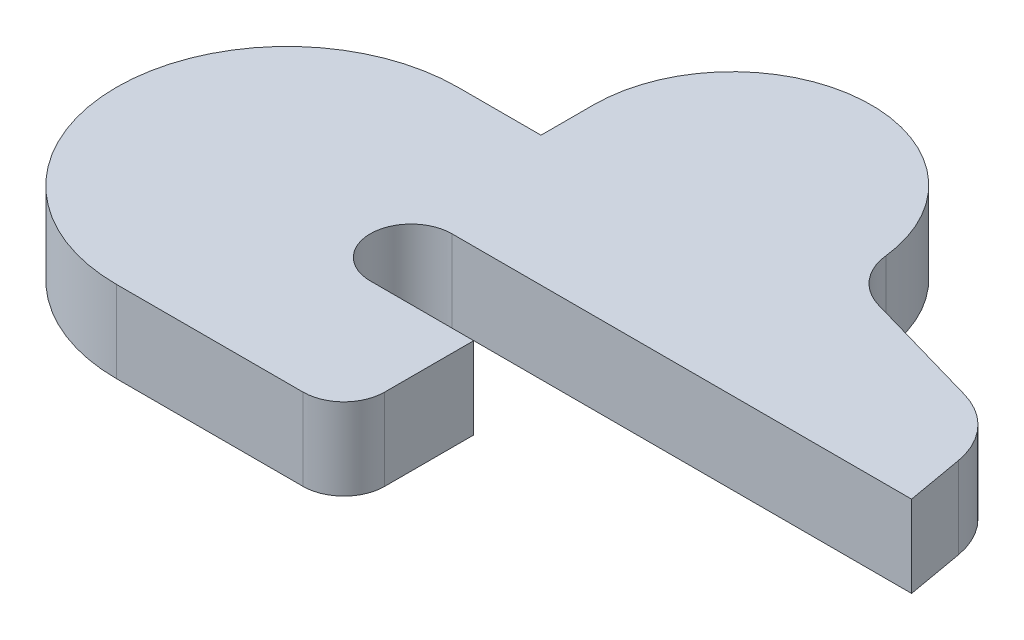
ISO-10303-21;
HEADER;
FILE_DESCRIPTION(('STEP AP214'),'2;1');
FILE_NAME('part.step','',(''),(''),'','','');
FILE_SCHEMA(('AUTOMOTIVE_DESIGN { 1 0 10303 214 1 1 1 1 }'));
ENDSEC;
DATA;
#1=APPLICATION_CONTEXT('core data for automotive mechanical design processes');
#2=APPLICATION_PROTOCOL_DEFINITION('international standard','automotive_design',2000,#1);
#3=PRODUCT_CONTEXT('',#1,'mechanical');
#4=PRODUCT('Part','Part','',(#3));
#5=PRODUCT_RELATED_PRODUCT_CATEGORY('part','',(#4));
#6=PRODUCT_DEFINITION_FORMATION('','',#4);
#7=PRODUCT_DEFINITION_CONTEXT('part definition',#1,'design');
#8=PRODUCT_DEFINITION('design','',#6,#7);
#9=PRODUCT_DEFINITION_SHAPE('','',#8);
#10=(LENGTH_UNIT() NAMED_UNIT(*) SI_UNIT(.MILLI.,.METRE.));
#11=(NAMED_UNIT(*) PLANE_ANGLE_UNIT() SI_UNIT($,.RADIAN.));
#12=(NAMED_UNIT(*) SI_UNIT($,.STERADIAN.) SOLID_ANGLE_UNIT());
#13=UNCERTAINTY_MEASURE_WITH_UNIT(LENGTH_MEASURE(1.E-05),#10,'distance_accuracy_value','');
#14=(GEOMETRIC_REPRESENTATION_CONTEXT(3) GLOBAL_UNCERTAINTY_ASSIGNED_CONTEXT((#13)) GLOBAL_UNIT_ASSIGNED_CONTEXT((#10,
#11,#12)) REPRESENTATION_CONTEXT('',''));
#15=CARTESIAN_POINT('',(0.,0.,0.));
#16=DIRECTION('',(0.,0.,1.));
#17=DIRECTION('',(1.,0.,0.));
#18=AXIS2_PLACEMENT_3D('',#15,#16,#17);
#19=CARTESIAN_POINT('',(0.,3.,3.27));
#20=DIRECTION('',(-1.,0.,0.));
#21=DIRECTION('',(0.,0.,1.));
#22=AXIS2_PLACEMENT_3D('',#19,#20,#21);
#23=PLANE('',#22);
#24=DIRECTION('',(0.,0.,-1.));
#25=VECTOR('',#24,1.);
#26=CARTESIAN_POINT('',(0.,0.,3.27));
#27=LINE('',#26,#25);
#28=CARTESIAN_POINT('',(0.,0.,3.27));
#29=VERTEX_POINT('',#28);
#30=CARTESIAN_POINT('',(0.,0.,0.));
#31=VERTEX_POINT('',#30);
#32=EDGE_CURVE('E165',#29,#31,#27,.T.);
#33=ORIENTED_EDGE('',*,*,#32,.T.);
#34=DIRECTION('',(0.,-1.,0.));
#35=VECTOR('',#34,1.);
#36=CARTESIAN_POINT('',(0.,3.,0.));
#37=LINE('',#36,#35);
#38=CARTESIAN_POINT('',(0.,3.,0.));
#39=VERTEX_POINT('',#38);
#40=EDGE_CURVE('E11',#39,#31,#37,.T.);
#41=ORIENTED_EDGE('',*,*,#40,.F.);
#42=DIRECTION('',(0.,0.,-1.));
#43=VECTOR('',#42,1.);
#44=CARTESIAN_POINT('',(0.,3.,3.27));
#45=LINE('',#44,#43);
#46=CARTESIAN_POINT('',(0.,3.,3.27));
#47=VERTEX_POINT('',#46);
#48=EDGE_CURVE('E191',#47,#39,#45,.T.);
#49=ORIENTED_EDGE('',*,*,#48,.F.);
#50=DIRECTION('',(0.,-1.,0.));
#51=VECTOR('',#50,1.);
#52=CARTESIAN_POINT('',(0.,3.,3.27));
#53=LINE('',#52,#51);
#54=EDGE_CURVE('E161',#47,#29,#53,.T.);
#55=ORIENTED_EDGE('',*,*,#54,.T.);
#56=EDGE_LOOP('',(#33,#41,#49,#55));
#57=FACE_BOUND('',#56,.T.);
#58=ADVANCED_FACE('F33',(#57),#23,.F.);
#59=CARTESIAN_POINT('',(0.,3.,0.));
#60=DIRECTION('',(0.,0.,1.));
#61=DIRECTION('',(1.,0.,0.));
#62=AXIS2_PLACEMENT_3D('',#59,#60,#61);
#63=PLANE('',#62);
#64=DIRECTION('',(-1.,0.,0.));
#65=VECTOR('',#64,1.);
#66=CARTESIAN_POINT('',(0.,0.,0.));
#67=LINE('',#66,#65);
#68=CARTESIAN_POINT('',(-3.8,0.,0.));
#69=VERTEX_POINT('',#68);
#70=EDGE_CURVE('E168',#31,#69,#67,.T.);
#71=ORIENTED_EDGE('',*,*,#70,.T.);
#72=DIRECTION('',(0.,-1.,0.));
#73=VECTOR('',#72,1.);
#74=CARTESIAN_POINT('',(-3.8,3.,0.));
#75=LINE('',#74,#73);
#76=CARTESIAN_POINT('',(-3.8,3.,0.));
#77=VERTEX_POINT('',#76);
#78=EDGE_CURVE('E41',#77,#69,#75,.T.);
#79=ORIENTED_EDGE('',*,*,#78,.F.);
#80=DIRECTION('',(-1.,0.,0.));
#81=VECTOR('',#80,1.);
#82=CARTESIAN_POINT('',(0.,3.,0.));
#83=LINE('',#82,#81);
#84=EDGE_CURVE('E110',#39,#77,#83,.T.);
#85=ORIENTED_EDGE('',*,*,#84,.F.);
#86=ORIENTED_EDGE('',*,*,#40,.T.);
#87=EDGE_LOOP('',(#71,#79,#85,#86));
#88=FACE_BOUND('',#87,.T.);
#89=ADVANCED_FACE('F279',(#88),#63,.F.);
#90=CARTESIAN_POINT('',(-3.8,3.,-1.5));
#91=DIRECTION('',(0.,-1.,0.));
#92=DIRECTION('',(0.,0.,-1.));
#93=AXIS2_PLACEMENT_3D('',#90,#91,#92);
#94=CYLINDRICAL_SURFACE('',#93,1.5);
#95=CARTESIAN_POINT('',(-3.8,0.,-1.5));
#96=DIRECTION('',(0.,-1.,0.));
#97=DIRECTION('',(0.,0.,-1.));
#98=AXIS2_PLACEMENT_3D('',#95,#96,#97);
#99=CIRCLE('',#98,1.5);
#100=CARTESIAN_POINT('',(-3.8,0.,-3.));
#101=VERTEX_POINT('',#100);
#102=EDGE_CURVE('E170',#69,#101,#99,.T.);
#103=ORIENTED_EDGE('',*,*,#102,.T.);
#104=DIRECTION('',(0.,-1.,0.));
#105=VECTOR('',#104,1.);
#106=CARTESIAN_POINT('',(-3.8,3.,-3.));
#107=LINE('',#106,#105);
#108=CARTESIAN_POINT('',(-3.8,3.,-3.));
#109=VERTEX_POINT('',#108);
#110=EDGE_CURVE('E216',#109,#101,#107,.T.);
#111=ORIENTED_EDGE('',*,*,#110,.F.);
#112=CARTESIAN_POINT('',(-3.8,3.,-1.5));
#113=DIRECTION('',(0.,-1.,0.));
#114=DIRECTION('',(0.,0.,-1.));
#115=AXIS2_PLACEMENT_3D('',#112,#113,#114);
#116=CIRCLE('',#115,1.5);
#117=EDGE_CURVE('E224',#77,#109,#116,.T.);
#118=ORIENTED_EDGE('',*,*,#117,.F.);
#119=ORIENTED_EDGE('',*,*,#78,.T.);
#120=EDGE_LOOP('',(#103,#111,#118,#119));
#121=FACE_BOUND('',#120,.T.);
#122=ADVANCED_FACE('F222',(#121),#94,.F.);
#123=CARTESIAN_POINT('',(-3.8,3.,-3.));
#124=DIRECTION('',(0.,0.,-1.));
#125=DIRECTION('',(-1.,0.,0.));
#126=AXIS2_PLACEMENT_3D('',#123,#124,#125);
#127=PLANE('',#126);
#128=DIRECTION('',(1.,0.,0.));
#129=VECTOR('',#128,1.);
#130=CARTESIAN_POINT('',(-3.8,0.,-3.));
#131=LINE('',#130,#129);
#132=CARTESIAN_POINT('',(13.0795080486299,0.,-3.));
#133=VERTEX_POINT('',#132);
#134=EDGE_CURVE('E172',#101,#133,#131,.T.);
#135=ORIENTED_EDGE('',*,*,#134,.T.);
#136=DIRECTION('',(0.,-1.,0.));
#137=VECTOR('',#136,1.);
#138=CARTESIAN_POINT('',(13.0795080486299,3.,-3.));
#139=LINE('',#138,#137);
#140=CARTESIAN_POINT('',(13.0795080486299,3.,-3.));
#141=VERTEX_POINT('',#140);
#142=EDGE_CURVE('E213',#141,#133,#139,.T.);
#143=ORIENTED_EDGE('',*,*,#142,.F.);
#144=DIRECTION('',(1.,0.,0.));
#145=VECTOR('',#144,1.);
#146=CARTESIAN_POINT('',(-3.8,3.,-3.));
#147=LINE('',#146,#145);
#148=EDGE_CURVE('E242',#109,#141,#147,.T.);
#149=ORIENTED_EDGE('',*,*,#148,.F.);
#150=ORIENTED_EDGE('',*,*,#110,.T.);
#151=EDGE_LOOP('',(#135,#143,#149,#150));
#152=FACE_BOUND('',#151,.T.);
#153=ADVANCED_FACE('F233',(#152),#127,.F.);
#154=CARTESIAN_POINT('',(13.0795080486299,3.,-3.));
#155=DIRECTION('',(-0.984807753012208,0.,0.173648177666934));
#156=DIRECTION('',(0.173648177666934,0.,0.984807753012208));
#157=AXIS2_PLACEMENT_3D('',#154,#155,#156);
#158=PLANE('',#157);
#159=DIRECTION('',(-0.173648177666934,0.,-0.984807753012207));
#160=VECTOR('',#159,1.);
#161=CARTESIAN_POINT('',(13.0795080486299,0.,-3.));
#162=LINE('',#161,#160);
#163=CARTESIAN_POINT('',(12.7106381862888,0.,-5.09196494409998));
#164=VERTEX_POINT('',#163);
#165=EDGE_CURVE('E174',#133,#164,#162,.T.);
#166=ORIENTED_EDGE('',*,*,#165,.T.);
#167=DIRECTION('',(0.,-1.,0.));
#168=VECTOR('',#167,1.);
#169=CARTESIAN_POINT('',(12.7106381862888,3.,-5.09196494409998));
#170=LINE('',#169,#168);
#171=CARTESIAN_POINT('',(12.7106381862888,3.,-5.09196494409998));
#172=VERTEX_POINT('',#171);
#173=EDGE_CURVE('E210',#172,#164,#170,.T.);
#174=ORIENTED_EDGE('',*,*,#173,.F.);
#175=DIRECTION('',(-0.173648177666934,0.,-0.984807753012207));
#176=VECTOR('',#175,1.);
#177=CARTESIAN_POINT('',(13.0795080486299,3.,-3.));
#178=LINE('',#177,#176);
#179=EDGE_CURVE('E239',#141,#172,#178,.T.);
#180=ORIENTED_EDGE('',*,*,#179,.F.);
#181=ORIENTED_EDGE('',*,*,#142,.T.);
#182=EDGE_LOOP('',(#166,#174,#180,#181));
#183=FACE_BOUND('',#182,.T.);
#184=ADVANCED_FACE('F237',(#183),#158,.F.);
#185=CARTESIAN_POINT('',(9.95317647785463,3.,-4.60575004663256));
#186=DIRECTION('',(0.,-1.,0.));
#187=DIRECTION('',(0.,0.,-1.));
#188=AXIS2_PLACEMENT_3D('',#185,#186,#187);
#189=CYLINDRICAL_SURFACE('',#188,2.8);
#190=CARTESIAN_POINT('',(9.95317647785463,0.,-4.60575004663256));
#191=DIRECTION('',(0.,1.,0.));
#192=DIRECTION('',(0.,0.,1.));
#193=AXIS2_PLACEMENT_3D('',#190,#191,#192);
#194=CIRCLE('',#193,2.8);
#195=CARTESIAN_POINT('',(10.7249610741422,0.,-7.29728279525986));
#196=VERTEX_POINT('',#195);
#197=EDGE_CURVE('E176',#164,#196,#194,.T.);
#198=ORIENTED_EDGE('',*,*,#197,.T.);
#199=DIRECTION('',(0.,-1.,0.));
#200=VECTOR('',#199,1.);
#201=CARTESIAN_POINT('',(10.7249610741422,3.,-7.29728279525986));
#202=LINE('',#201,#200);
#203=CARTESIAN_POINT('',(10.7249610741422,3.,-7.29728279525986));
#204=VERTEX_POINT('',#203);
#205=EDGE_CURVE('E207',#204,#196,#202,.T.);
#206=ORIENTED_EDGE('',*,*,#205,.F.);
#207=CARTESIAN_POINT('',(9.95317647785463,3.,-4.60575004663256));
#208=DIRECTION('',(0.,1.,0.));
#209=DIRECTION('',(0.,0.,1.));
#210=AXIS2_PLACEMENT_3D('',#207,#208,#209);
#211=CIRCLE('',#210,2.8);
#212=EDGE_CURVE('E241',#172,#204,#211,.T.);
#213=ORIENTED_EDGE('',*,*,#212,.F.);
#214=ORIENTED_EDGE('',*,*,#173,.T.);
#215=EDGE_LOOP('',(#198,#206,#213,#214));
#216=FACE_BOUND('',#215,.T.);
#217=ADVANCED_FACE('F292',(#216),#189,.T.);
#218=CARTESIAN_POINT('',(6.30470677412437,3.,-8.56477031967051));
#219=DIRECTION('',(-0.275637355816999,0.,0.961261695938319));
#220=DIRECTION('',(0.961261695938319,0.,0.275637355816999));
#221=AXIS2_PLACEMENT_3D('',#218,#219,#220);
#222=PLANE('',#221);
#223=DIRECTION('',(-0.961261695938319,0.,-0.275637355816999));
#224=VECTOR('',#223,1.);
#225=CARTESIAN_POINT('',(6.30470677412437,0.,-8.56477031967051));
#226=LINE('',#225,#224);
#227=CARTESIAN_POINT('',(6.30470677412437,0.,-8.56477031967051));
#228=VERTEX_POINT('',#227);
#229=EDGE_CURVE('E178',#196,#228,#226,.T.);
#230=ORIENTED_EDGE('',*,*,#229,.T.);
#231=DIRECTION('',(0.,-1.,0.));
#232=VECTOR('',#231,1.);
#233=CARTESIAN_POINT('',(6.30470677412437,3.,-8.56477031967051));
#234=LINE('',#233,#232);
#235=CARTESIAN_POINT('',(6.30470677412437,3.,-8.56477031967051));
#236=VERTEX_POINT('',#235);
#237=EDGE_CURVE('E204',#236,#228,#234,.T.);
#238=ORIENTED_EDGE('',*,*,#237,.F.);
#239=DIRECTION('',(-0.961261695938319,0.,-0.275637355816999));
#240=VECTOR('',#239,1.);
#241=CARTESIAN_POINT('',(6.30470677412437,3.,-8.56477031967051));
#242=LINE('',#241,#240);
#243=EDGE_CURVE('E244',#204,#236,#242,.T.);
#244=ORIENTED_EDGE('',*,*,#243,.F.);
#245=ORIENTED_EDGE('',*,*,#205,.T.);
#246=EDGE_LOOP('',(#230,#238,#244,#245));
#247=FACE_BOUND('',#246,.T.);
#248=ADVANCED_FACE('F295',(#247),#222,.F.);
#249=CARTESIAN_POINT('',(6.85598148575838,3.,-10.4872937115471));
#250=DIRECTION('',(0.,-1.,0.));
#251=DIRECTION('',(0.,0.,-1.));
#252=AXIS2_PLACEMENT_3D('',#249,#250,#251);
#253=CYLINDRICAL_SURFACE('',#252,2.);
#254=CARTESIAN_POINT('',(6.85598148575838,0.,-10.4872937115471));
#255=DIRECTION('',(0.,-1.,0.));
#256=DIRECTION('',(0.,0.,1.));
#257=AXIS2_PLACEMENT_3D('',#254,#255,#256);
#258=CIRCLE('',#257,2.);
#259=CARTESIAN_POINT('',(4.86838106723489,0.,-10.2649323473553));
#260=VERTEX_POINT('',#259);
#261=EDGE_CURVE('E180',#228,#260,#258,.T.);
#262=ORIENTED_EDGE('',*,*,#261,.T.);
#263=DIRECTION('',(0.,-1.,0.));
#264=VECTOR('',#263,1.);
#265=CARTESIAN_POINT('',(4.86838106723489,3.,-10.2649323473553));
#266=LINE('',#265,#264);
#267=CARTESIAN_POINT('',(4.86838106723489,3.,-10.2649323473553));
#268=VERTEX_POINT('',#267);
#269=EDGE_CURVE('E201',#268,#260,#266,.T.);
#270=ORIENTED_EDGE('',*,*,#269,.F.);
#271=CARTESIAN_POINT('',(6.85598148575838,3.,-10.4872937115471));
#272=DIRECTION('',(0.,-1.,0.));
#273=DIRECTION('',(0.,0.,1.));
#274=AXIS2_PLACEMENT_3D('',#271,#272,#273);
#275=CIRCLE('',#274,2.);
#276=EDGE_CURVE('E250',#236,#268,#275,.T.);
#277=ORIENTED_EDGE('',*,*,#276,.F.);
#278=ORIENTED_EDGE('',*,*,#237,.T.);
#279=EDGE_LOOP('',(#262,#270,#277,#278));
#280=FACE_BOUND('',#279,.T.);
#281=ADVANCED_FACE('F299',(#280),#253,.F.);
#282=CARTESIAN_POINT('',(-0.200000000000002,3.,-9.69791086866609));
#283=DIRECTION('',(0.,-1.,0.));
#284=DIRECTION('',(0.,0.,-1.));
#285=AXIS2_PLACEMENT_3D('',#282,#283,#284);
#286=CYLINDRICAL_SURFACE('',#285,5.1);
#287=CARTESIAN_POINT('',(-0.200000000000002,0.,-9.69791086866609));
#288=DIRECTION('',(0.,1.,0.));
#289=DIRECTION('',(0.,0.,-1.));
#290=AXIS2_PLACEMENT_3D('',#287,#288,#289);
#291=CIRCLE('',#290,5.1);
#292=CARTESIAN_POINT('',(-5.3,0.,-9.69791086866608));
#293=VERTEX_POINT('',#292);
#294=EDGE_CURVE('E182',#260,#293,#291,.T.);
#295=ORIENTED_EDGE('',*,*,#294,.T.);
#296=DIRECTION('',(0.,-1.,0.));
#297=VECTOR('',#296,1.);
#298=CARTESIAN_POINT('',(-5.3,3.,-9.69791086866608));
#299=LINE('',#298,#297);
#300=CARTESIAN_POINT('',(-5.3,3.,-9.69791086866608));
#301=VERTEX_POINT('',#300);
#302=EDGE_CURVE('E198',#301,#293,#299,.T.);
#303=ORIENTED_EDGE('',*,*,#302,.F.);
#304=CARTESIAN_POINT('',(-0.200000000000002,3.,-9.69791086866609));
#305=DIRECTION('',(0.,1.,0.));
#306=DIRECTION('',(0.,0.,-1.));
#307=AXIS2_PLACEMENT_3D('',#304,#305,#306);
#308=CIRCLE('',#307,5.1);
#309=EDGE_CURVE('E252',#268,#301,#308,.T.);
#310=ORIENTED_EDGE('',*,*,#309,.F.);
#311=ORIENTED_EDGE('',*,*,#269,.T.);
#312=EDGE_LOOP('',(#295,#303,#310,#311));
#313=FACE_BOUND('',#312,.T.);
#314=ADVANCED_FACE('F303',(#313),#286,.T.);
#315=CARTESIAN_POINT('',(-5.3,3.,-9.69791086866609));
#316=DIRECTION('',(1.,0.,0.));
#317=DIRECTION('',(0.,0.,-1.));
#318=AXIS2_PLACEMENT_3D('',#315,#316,#317);
#319=PLANE('',#318);
#320=DIRECTION('',(0.,0.,1.));
#321=VECTOR('',#320,1.);
#322=CARTESIAN_POINT('',(-5.3,0.,-9.69791086866609));
#323=LINE('',#322,#321);
#324=CARTESIAN_POINT('',(-5.3,0.,-7.77));
#325=VERTEX_POINT('',#324);
#326=EDGE_CURVE('E184',#293,#325,#323,.T.);
#327=ORIENTED_EDGE('',*,*,#326,.T.);
#328=DIRECTION('',(0.,-1.,0.));
#329=VECTOR('',#328,1.);
#330=CARTESIAN_POINT('',(-5.3,3.,-7.77));
#331=LINE('',#330,#329);
#332=CARTESIAN_POINT('',(-5.3,3.,-7.77));
#333=VERTEX_POINT('',#332);
#334=EDGE_CURVE('E195',#333,#325,#331,.T.);
#335=ORIENTED_EDGE('',*,*,#334,.F.);
#336=DIRECTION('',(0.,0.,1.));
#337=VECTOR('',#336,1.);
#338=CARTESIAN_POINT('',(-5.3,3.,-9.69791086866609));
#339=LINE('',#338,#337);
#340=EDGE_CURVE('E254',#301,#333,#339,.T.);
#341=ORIENTED_EDGE('',*,*,#340,.F.);
#342=ORIENTED_EDGE('',*,*,#302,.T.);
#343=EDGE_LOOP('',(#327,#335,#341,#342));
#344=FACE_BOUND('',#343,.T.);
#345=ADVANCED_FACE('F260',(#344),#319,.F.);
#346=CARTESIAN_POINT('',(-5.3,3.,-7.77));
#347=DIRECTION('',(0.,0.,1.));
#348=DIRECTION('',(1.,0.,0.));
#349=AXIS2_PLACEMENT_3D('',#346,#347,#348);
#350=PLANE('',#349);
#351=DIRECTION('',(-1.,0.,0.));
#352=VECTOR('',#351,1.);
#353=CARTESIAN_POINT('',(-5.3,0.,-7.77));
#354=LINE('',#353,#352);
#355=CARTESIAN_POINT('',(-8.35049195137008,0.,-7.77));
#356=VERTEX_POINT('',#355);
#357=EDGE_CURVE('E186',#325,#356,#354,.T.);
#358=ORIENTED_EDGE('',*,*,#357,.T.);
#359=DIRECTION('',(0.,-1.,0.));
#360=VECTOR('',#359,1.);
#361=CARTESIAN_POINT('',(-8.35049195137008,3.,-7.77));
#362=LINE('',#361,#360);
#363=CARTESIAN_POINT('',(-8.35049195137008,3.,-7.77));
#364=VERTEX_POINT('',#363);
#365=EDGE_CURVE('E156',#364,#356,#362,.T.);
#366=ORIENTED_EDGE('',*,*,#365,.F.);
#367=DIRECTION('',(-1.,0.,0.));
#368=VECTOR('',#367,1.);
#369=CARTESIAN_POINT('',(-5.3,3.,-7.77));
#370=LINE('',#369,#368);
#371=EDGE_CURVE('E147',#333,#364,#370,.T.);
#372=ORIENTED_EDGE('',*,*,#371,.F.);
#373=ORIENTED_EDGE('',*,*,#334,.T.);
#374=EDGE_LOOP('',(#358,#366,#372,#373));
#375=FACE_BOUND('',#374,.T.);
#376=ADVANCED_FACE('F264',(#375),#350,.F.);
#377=CARTESIAN_POINT('',(-8.35049195137008,3.,-1.5));
#378=DIRECTION('',(0.,-1.,0.));
#379=DIRECTION('',(0.,0.,-1.));
#380=AXIS2_PLACEMENT_3D('',#377,#378,#379);
#381=CYLINDRICAL_SURFACE('',#380,6.27);
#382=CARTESIAN_POINT('',(-8.35049195137008,0.,-1.5));
#383=DIRECTION('',(0.,1.,0.));
#384=DIRECTION('',(0.,0.,1.));
#385=AXIS2_PLACEMENT_3D('',#382,#383,#384);
#386=CIRCLE('',#385,6.27);
#387=CARTESIAN_POINT('',(-8.35049195137008,0.,4.77));
#388=VERTEX_POINT('',#387);
#389=EDGE_CURVE('E155',#356,#388,#386,.T.);
#390=ORIENTED_EDGE('',*,*,#389,.T.);
#391=DIRECTION('',(0.,-1.,0.));
#392=VECTOR('',#391,1.);
#393=CARTESIAN_POINT('',(-8.35049195137008,3.,4.77));
#394=LINE('',#393,#392);
#395=CARTESIAN_POINT('',(-8.35049195137008,3.,4.77));
#396=VERTEX_POINT('',#395);
#397=EDGE_CURVE('E152',#396,#388,#394,.T.);
#398=ORIENTED_EDGE('',*,*,#397,.F.);
#399=CARTESIAN_POINT('',(-8.35049195137008,3.,-1.5));
#400=DIRECTION('',(0.,1.,0.));
#401=DIRECTION('',(0.,0.,1.));
#402=AXIS2_PLACEMENT_3D('',#399,#400,#401);
#403=CIRCLE('',#402,6.27);
#404=EDGE_CURVE('E141',#364,#396,#403,.T.);
#405=ORIENTED_EDGE('',*,*,#404,.F.);
#406=ORIENTED_EDGE('',*,*,#365,.T.);
#407=EDGE_LOOP('',(#390,#398,#405,#406));
#408=FACE_BOUND('',#407,.T.);
#409=ADVANCED_FACE('F153',(#408),#381,.T.);
#410=CARTESIAN_POINT('',(-8.35049195137008,3.,4.77));
#411=DIRECTION('',(0.,0.,-1.));
#412=DIRECTION('',(-1.,0.,0.));
#413=AXIS2_PLACEMENT_3D('',#410,#411,#412);
#414=PLANE('',#413);
#415=DIRECTION('',(1.,0.,0.));
#416=VECTOR('',#415,1.);
#417=CARTESIAN_POINT('',(-8.35049195137008,0.,4.77));
#418=LINE('',#417,#416);
#419=CARTESIAN_POINT('',(-1.5,0.,4.77));
#420=VERTEX_POINT('',#419);
#421=EDGE_CURVE('E96',#388,#420,#418,.T.);
#422=ORIENTED_EDGE('',*,*,#421,.T.);
#423=DIRECTION('',(0.,-1.,0.));
#424=VECTOR('',#423,1.);
#425=CARTESIAN_POINT('',(-1.5,3.,4.77));
#426=LINE('',#425,#424);
#427=CARTESIAN_POINT('',(-1.5,3.,4.77));
#428=VERTEX_POINT('',#427);
#429=EDGE_CURVE('E157',#428,#420,#426,.T.);
#430=ORIENTED_EDGE('',*,*,#429,.F.);
#431=DIRECTION('',(1.,0.,0.));
#432=VECTOR('',#431,1.);
#433=CARTESIAN_POINT('',(-8.35049195137008,3.,4.77));
#434=LINE('',#433,#432);
#435=EDGE_CURVE('E145',#396,#428,#434,.T.);
#436=ORIENTED_EDGE('',*,*,#435,.F.);
#437=ORIENTED_EDGE('',*,*,#397,.T.);
#438=EDGE_LOOP('',(#422,#430,#436,#437));
#439=FACE_BOUND('',#438,.T.);
#440=ADVANCED_FACE('F159',(#439),#414,.F.);
#441=CARTESIAN_POINT('',(-1.5,3.,3.27));
#442=DIRECTION('',(0.,-1.,0.));
#443=DIRECTION('',(0.,0.,-1.));
#444=AXIS2_PLACEMENT_3D('',#441,#442,#443);
#445=CYLINDRICAL_SURFACE('',#444,1.5);
#446=CARTESIAN_POINT('',(-1.5,0.,3.27));
#447=DIRECTION('',(0.,1.,0.));
#448=DIRECTION('',(0.,0.,1.));
#449=AXIS2_PLACEMENT_3D('',#446,#447,#448);
#450=CIRCLE('',#449,1.5);
#451=EDGE_CURVE('E102',#420,#29,#450,.T.);
#452=ORIENTED_EDGE('',*,*,#451,.T.);
#453=ORIENTED_EDGE('',*,*,#54,.F.);
#454=CARTESIAN_POINT('',(-1.5,3.,3.27));
#455=DIRECTION('',(0.,1.,0.));
#456=DIRECTION('',(0.,0.,1.));
#457=AXIS2_PLACEMENT_3D('',#454,#455,#456);
#458=CIRCLE('',#457,1.5);
#459=EDGE_CURVE('E49',#428,#47,#458,.T.);
#460=ORIENTED_EDGE('',*,*,#459,.F.);
#461=ORIENTED_EDGE('',*,*,#429,.T.);
#462=EDGE_LOOP('',(#452,#453,#460,#461));
#463=FACE_BOUND('',#462,.T.);
#464=ADVANCED_FACE('F268',(#463),#445,.T.);
#465=CARTESIAN_POINT('',(-3.8,3.,-1.5));
#466=DIRECTION('',(0.,-1.,0.));
#467=DIRECTION('',(0.,0.,-1.));
#468=AXIS2_PLACEMENT_3D('',#465,#466,#467);
#469=PLANE('',#468);
#470=ORIENTED_EDGE('',*,*,#48,.T.);
#471=ORIENTED_EDGE('',*,*,#84,.T.);
#472=ORIENTED_EDGE('',*,*,#117,.T.);
#473=ORIENTED_EDGE('',*,*,#148,.T.);
#474=ORIENTED_EDGE('',*,*,#179,.T.);
#475=ORIENTED_EDGE('',*,*,#212,.T.);
#476=ORIENTED_EDGE('',*,*,#243,.T.);
#477=ORIENTED_EDGE('',*,*,#276,.T.);
#478=ORIENTED_EDGE('',*,*,#309,.T.);
#479=ORIENTED_EDGE('',*,*,#340,.T.);
#480=ORIENTED_EDGE('',*,*,#371,.T.);
#481=ORIENTED_EDGE('',*,*,#404,.T.);
#482=ORIENTED_EDGE('',*,*,#435,.T.);
#483=ORIENTED_EDGE('',*,*,#459,.T.);
#484=EDGE_LOOP('',(#470,#471,#472,#473,#474,#475,#476,#477,#478,#479,#480,#481,#482,#483));
#485=FACE_BOUND('',#484,.T.);
#486=ADVANCED_FACE('F143',(#485),#469,.F.);
#487=CARTESIAN_POINT('',(-3.8,0.,-1.5));
#488=DIRECTION('',(0.,-1.,0.));
#489=DIRECTION('',(0.,0.,-1.));
#490=AXIS2_PLACEMENT_3D('',#487,#488,#489);
#491=PLANE('',#490);
#492=ORIENTED_EDGE('',*,*,#32,.F.);
#493=ORIENTED_EDGE('',*,*,#451,.F.);
#494=ORIENTED_EDGE('',*,*,#421,.F.);
#495=ORIENTED_EDGE('',*,*,#389,.F.);
#496=ORIENTED_EDGE('',*,*,#357,.F.);
#497=ORIENTED_EDGE('',*,*,#326,.F.);
#498=ORIENTED_EDGE('',*,*,#294,.F.);
#499=ORIENTED_EDGE('',*,*,#261,.F.);
#500=ORIENTED_EDGE('',*,*,#229,.F.);
#501=ORIENTED_EDGE('',*,*,#197,.F.);
#502=ORIENTED_EDGE('',*,*,#165,.F.);
#503=ORIENTED_EDGE('',*,*,#134,.F.);
#504=ORIENTED_EDGE('',*,*,#102,.F.);
#505=ORIENTED_EDGE('',*,*,#70,.F.);
#506=EDGE_LOOP('',(#492,#493,#494,#495,#496,#497,#498,#499,#500,#501,#502,#503,#504,#505));
#507=FACE_BOUND('',#506,.T.);
#508=ADVANCED_FACE('F228',(#507),#491,.T.);
#509=CLOSED_SHELL('',(#58,#89,#122,#153,#184,#217,#248,#281,#314,#345,#376,#409,#440,#464,#486,#508));
#510=MANIFOLD_SOLID_BREP('B2',#509);
#511=ADVANCED_BREP_SHAPE_REPRESENTATION('',(#18,#510),#14);
#512=SHAPE_DEFINITION_REPRESENTATION(#9,#511);
ENDSEC;
END-ISO-10303-21;
